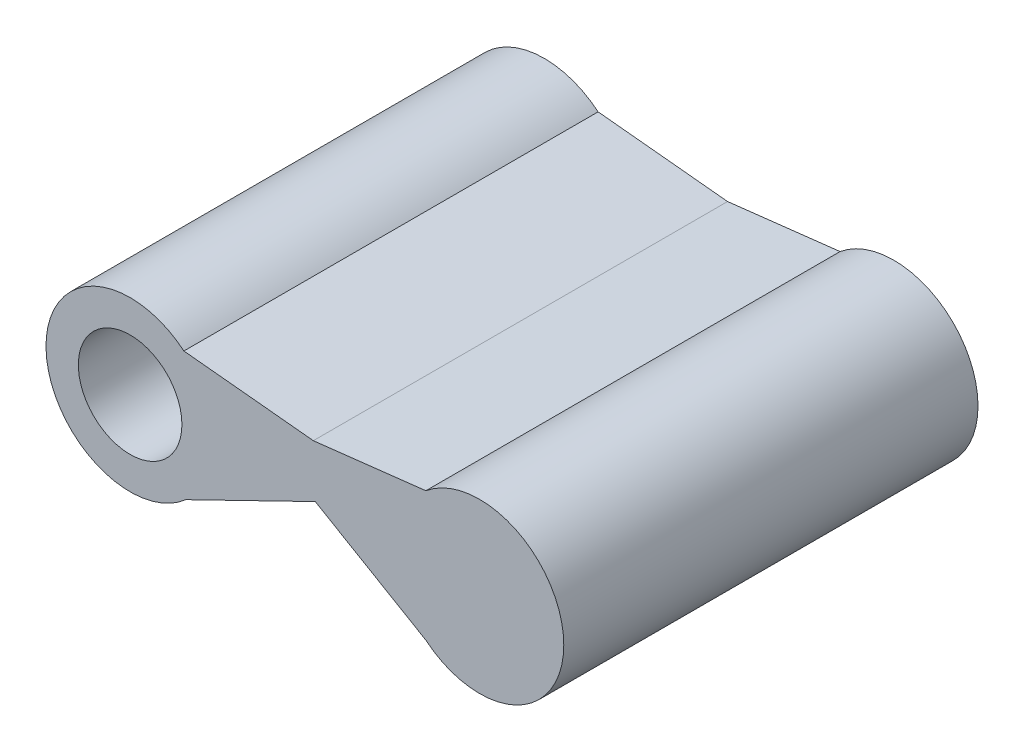
ISO-10303-21;
HEADER;
FILE_DESCRIPTION(('STEP AP214'),'2;1');
FILE_NAME('part.step','',(''),(''),'','','');
FILE_SCHEMA(('AUTOMOTIVE_DESIGN { 1 0 10303 214 1 1 1 1 }'));
ENDSEC;
DATA;
#1=APPLICATION_CONTEXT('core data for automotive mechanical design processes');
#2=APPLICATION_PROTOCOL_DEFINITION('international standard','automotive_design',2000,#1);
#3=PRODUCT_CONTEXT('',#1,'mechanical');
#4=PRODUCT('Part','Part','',(#3));
#5=PRODUCT_RELATED_PRODUCT_CATEGORY('part','',(#4));
#6=PRODUCT_DEFINITION_FORMATION('','',#4);
#7=PRODUCT_DEFINITION_CONTEXT('part definition',#1,'design');
#8=PRODUCT_DEFINITION('design','',#6,#7);
#9=PRODUCT_DEFINITION_SHAPE('','',#8);
#10=(LENGTH_UNIT() NAMED_UNIT(*) SI_UNIT(.MILLI.,.METRE.));
#11=(NAMED_UNIT(*) PLANE_ANGLE_UNIT() SI_UNIT($,.RADIAN.));
#12=(NAMED_UNIT(*) SI_UNIT($,.STERADIAN.) SOLID_ANGLE_UNIT());
#13=UNCERTAINTY_MEASURE_WITH_UNIT(LENGTH_MEASURE(1.E-05),#10,'distance_accuracy_value','');
#14=(GEOMETRIC_REPRESENTATION_CONTEXT(3) GLOBAL_UNCERTAINTY_ASSIGNED_CONTEXT((#13)) GLOBAL_UNIT_ASSIGNED_CONTEXT((#10,
#11,#12)) REPRESENTATION_CONTEXT('',''));
#15=CARTESIAN_POINT('',(0.,0.,0.));
#16=DIRECTION('',(0.,0.,1.));
#17=DIRECTION('',(1.,0.,0.));
#18=AXIS2_PLACEMENT_3D('',#15,#16,#17);
#19=CARTESIAN_POINT('',(13.5,0.,16.));
#20=DIRECTION('',(0.,0.,1.));
#21=DIRECTION('',(1.,0.,0.));
#22=AXIS2_PLACEMENT_3D('',#19,#20,#21);
#23=PLANE('',#22);
#24=CARTESIAN_POINT('',(13.5,0.,16.));
#25=DIRECTION('',(0.,0.,1.));
#26=DIRECTION('',(1.,0.,0.));
#27=AXIS2_PLACEMENT_3D('',#24,#25,#26);
#28=CIRCLE('',#27,3.25);
#29=CARTESIAN_POINT('',(11.4233440342705,-2.5,16.));
#30=VERTEX_POINT('',#29);
#31=CARTESIAN_POINT('',(11.4233440342705,2.5,16.));
#32=VERTEX_POINT('',#31);
#33=EDGE_CURVE('E132',#30,#32,#28,.T.);
#34=ORIENTED_EDGE('',*,*,#33,.T.);
#35=DIRECTION('',(-0.993448977836836,-0.114276543677806,0.));
#36=VECTOR('',#35,1.);
#37=CARTESIAN_POINT('',(7.07665596572952,2.,16.));
#38=LINE('',#37,#36);
#39=CARTESIAN_POINT('',(7.07665596572952,2.,16.));
#40=VERTEX_POINT('',#39);
#41=EDGE_CURVE('E90',#32,#40,#38,.T.);
#42=ORIENTED_EDGE('',*,*,#41,.T.);
#43=DIRECTION('',(-0.995037190209989,0.0995037190209988,0.));
#44=VECTOR('',#43,1.);
#45=CARTESIAN_POINT('',(2.07665596572952,2.5,16.));
#46=LINE('',#45,#44);
#47=CARTESIAN_POINT('',(2.07665596572952,2.5,16.));
#48=VERTEX_POINT('',#47);
#49=EDGE_CURVE('E103',#40,#48,#46,.T.);
#50=ORIENTED_EDGE('',*,*,#49,.T.);
#51=CARTESIAN_POINT('',(0.,0.,16.));
#52=DIRECTION('',(0.,0.,1.));
#53=DIRECTION('',(1.,0.,0.));
#54=AXIS2_PLACEMENT_3D('',#51,#52,#53);
#55=CIRCLE('',#54,3.25);
#56=CARTESIAN_POINT('',(2.15163608837826,-2.43576725965111,16.));
#57=VERTEX_POINT('',#56);
#58=EDGE_CURVE('E97',#48,#57,#55,.T.);
#59=ORIENTED_EDGE('',*,*,#58,.T.);
#60=DIRECTION('',(0.898999084152577,0.437950507127036,0.));
#61=VECTOR('',#60,1.);
#62=CARTESIAN_POINT('',(2.15163608837826,-2.43576725965111,16.));
#63=LINE('',#62,#61);
#64=CARTESIAN_POINT('',(7.15163608837827,0.,16.));
#65=VERTEX_POINT('',#64);
#66=EDGE_CURVE('E101',#57,#65,#63,.T.);
#67=ORIENTED_EDGE('',*,*,#66,.T.);
#68=DIRECTION('',(0.863059562721135,-0.505102159167433,0.));
#69=VECTOR('',#68,1.);
#70=CARTESIAN_POINT('',(7.15163608837827,0.,16.));
#71=LINE('',#70,#69);
#72=EDGE_CURVE('E53',#65,#30,#71,.T.);
#73=ORIENTED_EDGE('',*,*,#72,.T.);
#74=EDGE_LOOP('',(#34,#42,#50,#59,#67,#73));
#75=FACE_BOUND('',#74,.T.);
#76=CARTESIAN_POINT('',(0.,0.,16.));
#77=DIRECTION('',(0.,0.,1.));
#78=DIRECTION('',(1.,0.,0.));
#79=AXIS2_PLACEMENT_3D('',#76,#77,#78);
#80=CIRCLE('',#79,2.);
#81=CARTESIAN_POINT('',(2.,0.,16.));
#82=VERTEX_POINT('',#81);
#83=EDGE_CURVE('E125',#82,#82,#80,.T.);
#84=ORIENTED_EDGE('',*,*,#83,.F.);
#85=EDGE_LOOP('',(#84));
#86=FACE_BOUND('',#85,.T.);
#87=ADVANCED_FACE('F36',(#75,#86),#23,.T.);
#88=CARTESIAN_POINT('',(13.5,0.,0.));
#89=DIRECTION('',(0.,0.,1.));
#90=DIRECTION('',(1.,0.,0.));
#91=AXIS2_PLACEMENT_3D('',#88,#89,#90);
#92=PLANE('',#91);
#93=CARTESIAN_POINT('',(13.5,0.,0.));
#94=DIRECTION('',(0.,0.,1.));
#95=DIRECTION('',(1.,0.,0.));
#96=AXIS2_PLACEMENT_3D('',#93,#94,#95);
#97=CIRCLE('',#96,3.25);
#98=CARTESIAN_POINT('',(11.4233440342705,-2.5,0.));
#99=VERTEX_POINT('',#98);
#100=CARTESIAN_POINT('',(11.4233440342705,2.5,0.));
#101=VERTEX_POINT('',#100);
#102=EDGE_CURVE('E121',#99,#101,#97,.T.);
#103=ORIENTED_EDGE('',*,*,#102,.F.);
#104=DIRECTION('',(0.863059562721135,-0.505102159167433,0.));
#105=VECTOR('',#104,1.);
#106=CARTESIAN_POINT('',(7.15163608837827,0.,0.));
#107=LINE('',#106,#105);
#108=CARTESIAN_POINT('',(7.15163608837827,0.,0.));
#109=VERTEX_POINT('',#108);
#110=EDGE_CURVE('E82',#109,#99,#107,.T.);
#111=ORIENTED_EDGE('',*,*,#110,.F.);
#112=DIRECTION('',(0.898999084152577,0.437950507127036,0.));
#113=VECTOR('',#112,1.);
#114=CARTESIAN_POINT('',(2.15163608837826,-2.43576725965111,0.));
#115=LINE('',#114,#113);
#116=CARTESIAN_POINT('',(2.15163608837826,-2.43576725965111,0.));
#117=VERTEX_POINT('',#116);
#118=EDGE_CURVE('E76',#117,#109,#115,.T.);
#119=ORIENTED_EDGE('',*,*,#118,.F.);
#120=CARTESIAN_POINT('',(0.,0.,0.));
#121=DIRECTION('',(0.,0.,1.));
#122=DIRECTION('',(1.,0.,0.));
#123=AXIS2_PLACEMENT_3D('',#120,#121,#122);
#124=CIRCLE('',#123,3.25);
#125=CARTESIAN_POINT('',(2.07665596572952,2.5,0.));
#126=VERTEX_POINT('',#125);
#127=EDGE_CURVE('E111',#126,#117,#124,.T.);
#128=ORIENTED_EDGE('',*,*,#127,.F.);
#129=DIRECTION('',(-0.995037190209989,0.0995037190209988,0.));
#130=VECTOR('',#129,1.);
#131=CARTESIAN_POINT('',(2.07665596572952,2.5,0.));
#132=LINE('',#131,#130);
#133=CARTESIAN_POINT('',(7.07665596572952,2.,0.));
#134=VERTEX_POINT('',#133);
#135=EDGE_CURVE('E127',#134,#126,#132,.T.);
#136=ORIENTED_EDGE('',*,*,#135,.F.);
#137=DIRECTION('',(-0.993448977836836,-0.114276543677806,0.));
#138=VECTOR('',#137,1.);
#139=CARTESIAN_POINT('',(7.07665596572952,2.,0.));
#140=LINE('',#139,#138);
#141=EDGE_CURVE('E124',#101,#134,#140,.T.);
#142=ORIENTED_EDGE('',*,*,#141,.F.);
#143=EDGE_LOOP('',(#103,#111,#119,#128,#136,#142));
#144=FACE_BOUND('',#143,.T.);
#145=CARTESIAN_POINT('',(0.,0.,0.));
#146=DIRECTION('',(0.,0.,1.));
#147=DIRECTION('',(1.,0.,0.));
#148=AXIS2_PLACEMENT_3D('',#145,#146,#147);
#149=CIRCLE('',#148,2.);
#150=CARTESIAN_POINT('',(2.,0.,0.));
#151=VERTEX_POINT('',#150);
#152=EDGE_CURVE('E225',#151,#151,#149,.T.);
#153=ORIENTED_EDGE('',*,*,#152,.T.);
#154=EDGE_LOOP('',(#153));
#155=FACE_BOUND('',#154,.T.);
#156=ADVANCED_FACE('F141',(#144,#155),#92,.F.);
#157=CARTESIAN_POINT('',(13.5,0.,16.));
#158=DIRECTION('',(0.,0.,-1.));
#159=DIRECTION('',(-1.,0.,0.));
#160=AXIS2_PLACEMENT_3D('',#157,#158,#159);
#161=CYLINDRICAL_SURFACE('',#160,3.25);
#162=ORIENTED_EDGE('',*,*,#102,.T.);
#163=DIRECTION('',(0.,0.,-1.));
#164=VECTOR('',#163,1.);
#165=CARTESIAN_POINT('',(11.4233440342705,2.5,16.));
#166=LINE('',#165,#164);
#167=EDGE_CURVE('E11',#32,#101,#166,.T.);
#168=ORIENTED_EDGE('',*,*,#167,.F.);
#169=ORIENTED_EDGE('',*,*,#33,.F.);
#170=DIRECTION('',(0.,0.,-1.));
#171=VECTOR('',#170,1.);
#172=CARTESIAN_POINT('',(11.4233440342705,-2.5,16.));
#173=LINE('',#172,#171);
#174=EDGE_CURVE('E117',#30,#99,#173,.T.);
#175=ORIENTED_EDGE('',*,*,#174,.T.);
#176=EDGE_LOOP('',(#162,#168,#169,#175));
#177=FACE_BOUND('',#176,.T.);
#178=ADVANCED_FACE('F38',(#177),#161,.T.);
#179=CARTESIAN_POINT('',(7.07665596572952,2.,16.));
#180=DIRECTION('',(0.114276543677806,-0.993448977836836,0.));
#181=DIRECTION('',(0.993448977836836,0.114276543677806,0.));
#182=AXIS2_PLACEMENT_3D('',#179,#180,#181);
#183=PLANE('',#182);
#184=ORIENTED_EDGE('',*,*,#141,.T.);
#185=DIRECTION('',(0.,0.,-1.));
#186=VECTOR('',#185,1.);
#187=CARTESIAN_POINT('',(7.07665596572952,2.,16.));
#188=LINE('',#187,#186);
#189=EDGE_CURVE('E45',#40,#134,#188,.T.);
#190=ORIENTED_EDGE('',*,*,#189,.F.);
#191=ORIENTED_EDGE('',*,*,#41,.F.);
#192=ORIENTED_EDGE('',*,*,#167,.T.);
#193=EDGE_LOOP('',(#184,#190,#191,#192));
#194=FACE_BOUND('',#193,.T.);
#195=ADVANCED_FACE('F166',(#194),#183,.F.);
#196=CARTESIAN_POINT('',(2.07665596572952,2.5,16.));
#197=DIRECTION('',(-0.0995037190209989,-0.995037190209989,0.));
#198=DIRECTION('',(0.995037190209989,-0.0995037190209989,0.));
#199=AXIS2_PLACEMENT_3D('',#196,#197,#198);
#200=PLANE('',#199);
#201=ORIENTED_EDGE('',*,*,#135,.T.);
#202=DIRECTION('',(0.,0.,-1.));
#203=VECTOR('',#202,1.);
#204=CARTESIAN_POINT('',(2.07665596572952,2.5,16.));
#205=LINE('',#204,#203);
#206=EDGE_CURVE('E112',#48,#126,#205,.T.);
#207=ORIENTED_EDGE('',*,*,#206,.F.);
#208=ORIENTED_EDGE('',*,*,#49,.F.);
#209=ORIENTED_EDGE('',*,*,#189,.T.);
#210=EDGE_LOOP('',(#201,#207,#208,#209));
#211=FACE_BOUND('',#210,.T.);
#212=ADVANCED_FACE('F138',(#211),#200,.F.);
#213=CARTESIAN_POINT('',(0.,0.,16.));
#214=DIRECTION('',(0.,0.,-1.));
#215=DIRECTION('',(-1.,0.,0.));
#216=AXIS2_PLACEMENT_3D('',#213,#214,#215);
#217=CYLINDRICAL_SURFACE('',#216,3.25);
#218=ORIENTED_EDGE('',*,*,#127,.T.);
#219=DIRECTION('',(0.,0.,-1.));
#220=VECTOR('',#219,1.);
#221=CARTESIAN_POINT('',(2.15163608837826,-2.43576725965111,16.));
#222=LINE('',#221,#220);
#223=EDGE_CURVE('E108',#57,#117,#222,.T.);
#224=ORIENTED_EDGE('',*,*,#223,.F.);
#225=ORIENTED_EDGE('',*,*,#58,.F.);
#226=ORIENTED_EDGE('',*,*,#206,.T.);
#227=EDGE_LOOP('',(#218,#224,#225,#226));
#228=FACE_BOUND('',#227,.T.);
#229=ADVANCED_FACE('F109',(#228),#217,.T.);
#230=CARTESIAN_POINT('',(2.15163608837826,-2.43576725965111,16.));
#231=DIRECTION('',(-0.437950507127036,0.898999084152577,0.));
#232=DIRECTION('',(-0.898999084152577,-0.437950507127036,0.));
#233=AXIS2_PLACEMENT_3D('',#230,#231,#232);
#234=PLANE('',#233);
#235=ORIENTED_EDGE('',*,*,#118,.T.);
#236=DIRECTION('',(0.,0.,-1.));
#237=VECTOR('',#236,1.);
#238=CARTESIAN_POINT('',(7.15163608837827,0.,16.));
#239=LINE('',#238,#237);
#240=EDGE_CURVE('E113',#65,#109,#239,.T.);
#241=ORIENTED_EDGE('',*,*,#240,.F.);
#242=ORIENTED_EDGE('',*,*,#66,.F.);
#243=ORIENTED_EDGE('',*,*,#223,.T.);
#244=EDGE_LOOP('',(#235,#241,#242,#243));
#245=FACE_BOUND('',#244,.T.);
#246=ADVANCED_FACE('F115',(#245),#234,.F.);
#247=CARTESIAN_POINT('',(7.15163608837827,0.,16.));
#248=DIRECTION('',(0.505102159167433,0.863059562721135,0.));
#249=DIRECTION('',(-0.863059562721135,0.505102159167433,0.));
#250=AXIS2_PLACEMENT_3D('',#247,#248,#249);
#251=PLANE('',#250);
#252=ORIENTED_EDGE('',*,*,#110,.T.);
#253=ORIENTED_EDGE('',*,*,#174,.F.);
#254=ORIENTED_EDGE('',*,*,#72,.F.);
#255=ORIENTED_EDGE('',*,*,#240,.T.);
#256=EDGE_LOOP('',(#252,#253,#254,#255));
#257=FACE_BOUND('',#256,.T.);
#258=ADVANCED_FACE('F146',(#257),#251,.F.);
#259=CARTESIAN_POINT('',(0.,0.,16.));
#260=DIRECTION('',(0.,0.,-1.));
#261=DIRECTION('',(-1.,0.,0.));
#262=AXIS2_PLACEMENT_3D('',#259,#260,#261);
#263=CYLINDRICAL_SURFACE('',#262,2.);
#264=ORIENTED_EDGE('',*,*,#83,.T.);
#265=EDGE_LOOP('',(#264));
#266=FACE_BOUND('',#265,.T.);
#267=ORIENTED_EDGE('',*,*,#152,.F.);
#268=EDGE_LOOP('',(#267));
#269=FACE_BOUND('',#268,.T.);
#270=ADVANCED_FACE('F148',(#266,#269),#263,.F.);
#271=CLOSED_SHELL('',(#87,#156,#178,#195,#212,#229,#246,#258,#270));
#272=MANIFOLD_SOLID_BREP('B2',#271);
#273=ADVANCED_BREP_SHAPE_REPRESENTATION('',(#18,#272),#14);
#274=SHAPE_DEFINITION_REPRESENTATION(#9,#273);
ENDSEC;
END-ISO-10303-21;
